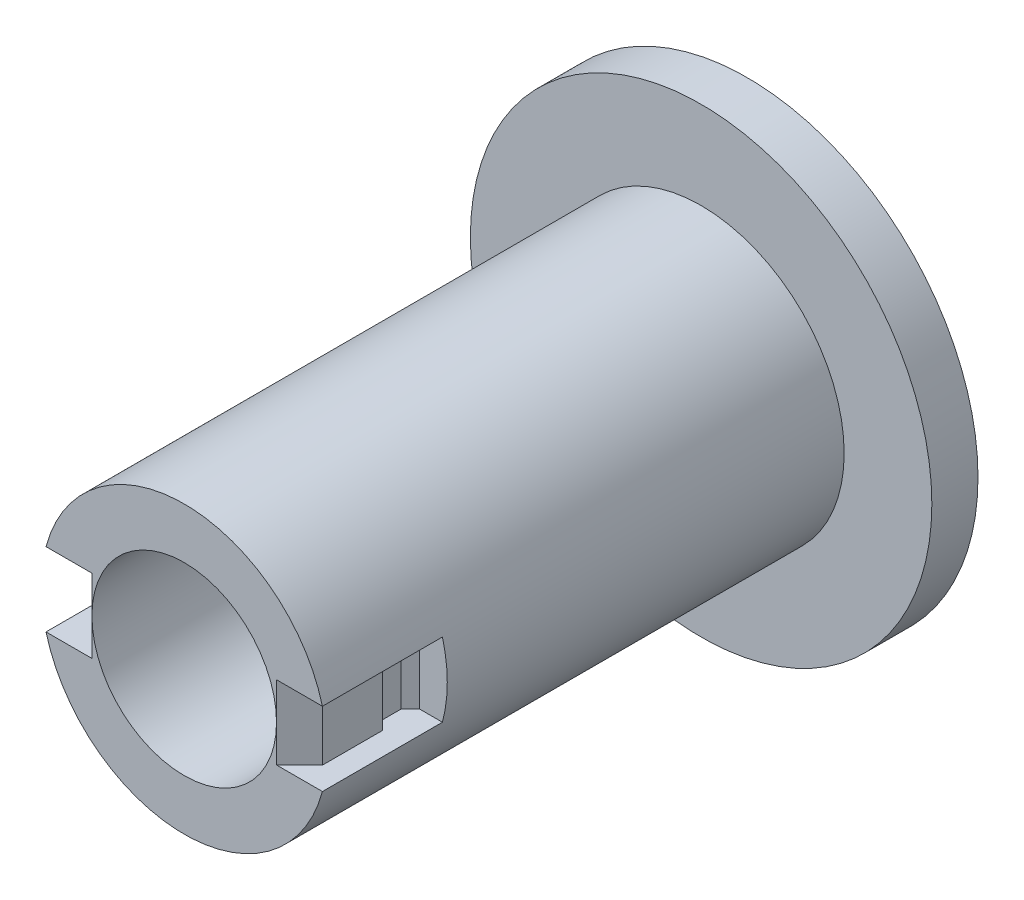
ISO-10303-21;
HEADER;
FILE_DESCRIPTION(('STEP AP214'),'2;1');
FILE_NAME('part.step','',(''),(''),'','','');
FILE_SCHEMA(('AUTOMOTIVE_DESIGN { 1 0 10303 214 1 1 1 1 }'));
ENDSEC;
DATA;
#1=APPLICATION_CONTEXT('core data for automotive mechanical design processes');
#2=APPLICATION_PROTOCOL_DEFINITION('international standard','automotive_design',2000,#1);
#3=PRODUCT_CONTEXT('',#1,'mechanical');
#4=PRODUCT('Part','Part','',(#3));
#5=PRODUCT_RELATED_PRODUCT_CATEGORY('part','',(#4));
#6=PRODUCT_DEFINITION_FORMATION('','',#4);
#7=PRODUCT_DEFINITION_CONTEXT('part definition',#1,'design');
#8=PRODUCT_DEFINITION('design','',#6,#7);
#9=PRODUCT_DEFINITION_SHAPE('','',#8);
#10=(LENGTH_UNIT() NAMED_UNIT(*) SI_UNIT(.MILLI.,.METRE.));
#11=(NAMED_UNIT(*) PLANE_ANGLE_UNIT() SI_UNIT($,.RADIAN.));
#12=(NAMED_UNIT(*) SI_UNIT($,.STERADIAN.) SOLID_ANGLE_UNIT());
#13=UNCERTAINTY_MEASURE_WITH_UNIT(LENGTH_MEASURE(1.E-05),#10,'distance_accuracy_value','');
#14=(GEOMETRIC_REPRESENTATION_CONTEXT(3) GLOBAL_UNCERTAINTY_ASSIGNED_CONTEXT((#13)) GLOBAL_UNIT_ASSIGNED_CONTEXT((#10,
#11,#12)) REPRESENTATION_CONTEXT('',''));
#15=CARTESIAN_POINT('',(0.,0.,0.));
#16=DIRECTION('',(0.,0.,1.));
#17=DIRECTION('',(1.,0.,0.));
#18=AXIS2_PLACEMENT_3D('',#15,#16,#17);
#19=CARTESIAN_POINT('',(0.,0.,56.));
#20=DIRECTION('',(0.,0.,1.));
#21=DIRECTION('',(1.,0.,0.));
#22=AXIS2_PLACEMENT_3D('',#19,#20,#21);
#23=PLANE('',#22);
#24=DIRECTION('',(-1.,0.,0.));
#25=VECTOR('',#24,1.);
#26=CARTESIAN_POINT('',(0.,4.,56.));
#27=LINE('',#26,#25);
#28=CARTESIAN_POINT('',(-10.,4.,56.));
#29=VERTEX_POINT('',#28);
#30=CARTESIAN_POINT('',(-14.9749791318719,4.,56.));
#31=VERTEX_POINT('',#30);
#32=EDGE_CURVE('E191',#29,#31,#27,.T.);
#33=ORIENTED_EDGE('',*,*,#32,.F.);
#34=DIRECTION('',(0.,-1.,0.));
#35=VECTOR('',#34,1.);
#36=CARTESIAN_POINT('',(-10.,4.,56.));
#37=LINE('',#36,#35);
#38=CARTESIAN_POINT('',(-10.,0.,56.));
#39=VERTEX_POINT('',#38);
#40=EDGE_CURVE('E169',#29,#39,#37,.T.);
#41=ORIENTED_EDGE('',*,*,#40,.T.);
#42=CARTESIAN_POINT('',(0.,0.,56.));
#43=DIRECTION('',(0.,0.,1.));
#44=DIRECTION('',(1.,0.,0.));
#45=AXIS2_PLACEMENT_3D('',#42,#43,#44);
#46=CIRCLE('',#45,10.);
#47=CARTESIAN_POINT('',(10.,0.,56.));
#48=VERTEX_POINT('',#47);
#49=EDGE_CURVE('E277',#48,#39,#46,.T.);
#50=ORIENTED_EDGE('',*,*,#49,.F.);
#51=DIRECTION('',(0.,-1.,0.));
#52=VECTOR('',#51,1.);
#53=CARTESIAN_POINT('',(10.,4.,56.));
#54=LINE('',#53,#52);
#55=CARTESIAN_POINT('',(10.,4.,56.));
#56=VERTEX_POINT('',#55);
#57=EDGE_CURVE('E256',#56,#48,#54,.T.);
#58=ORIENTED_EDGE('',*,*,#57,.F.);
#59=DIRECTION('',(1.,0.,0.));
#60=VECTOR('',#59,1.);
#61=CARTESIAN_POINT('',(0.,4.,56.));
#62=LINE('',#61,#60);
#63=CARTESIAN_POINT('',(14.9749791318719,4.,56.));
#64=VERTEX_POINT('',#63);
#65=EDGE_CURVE('E247',#56,#64,#62,.T.);
#66=ORIENTED_EDGE('',*,*,#65,.T.);
#67=CARTESIAN_POINT('',(0.,0.,56.));
#68=DIRECTION('',(0.,0.,1.));
#69=DIRECTION('',(1.,0.,0.));
#70=AXIS2_PLACEMENT_3D('',#67,#68,#69);
#71=CIRCLE('',#70,15.5);
#72=EDGE_CURVE('E289',#64,#31,#71,.T.);
#73=ORIENTED_EDGE('',*,*,#72,.T.);
#74=EDGE_LOOP('',(#33,#41,#50,#58,#66,#73));
#75=FACE_BOUND('',#74,.T.);
#76=ADVANCED_FACE('F33',(#75),#23,.T.);
#77=CARTESIAN_POINT('',(0.,0.,56.));
#78=DIRECTION('',(0.,0.,-1.));
#79=DIRECTION('',(-1.,0.,0.));
#80=AXIS2_PLACEMENT_3D('',#77,#78,#79);
#81=CYLINDRICAL_SURFACE('',#80,15.5);
#82=CARTESIAN_POINT('',(0.,0.,43.));
#83=DIRECTION('',(0.,0.,-1.));
#84=DIRECTION('',(-1.,0.,0.));
#85=AXIS2_PLACEMENT_3D('',#82,#83,#84);
#86=CIRCLE('',#85,15.5);
#87=CARTESIAN_POINT('',(-14.9749791318719,-4.,43.));
#88=VERTEX_POINT('',#87);
#89=CARTESIAN_POINT('',(-14.9749791318719,4.,43.));
#90=VERTEX_POINT('',#89);
#91=EDGE_CURVE('E11',#88,#90,#86,.T.);
#92=ORIENTED_EDGE('',*,*,#91,.T.);
#93=DIRECTION('',(0.,0.,-1.));
#94=VECTOR('',#93,1.);
#95=CARTESIAN_POINT('',(-14.9749791318719,4.,56.));
#96=LINE('',#95,#94);
#97=EDGE_CURVE('E217',#90,#31,#96,.F.);
#98=ORIENTED_EDGE('',*,*,#97,.T.);
#99=ORIENTED_EDGE('',*,*,#72,.F.);
#100=DIRECTION('',(0.,0.,-1.));
#101=VECTOR('',#100,1.);
#102=CARTESIAN_POINT('',(14.9749791318719,4.,56.));
#103=LINE('',#102,#101);
#104=CARTESIAN_POINT('',(14.9749791318719,4.,43.));
#105=VERTEX_POINT('',#104);
#106=EDGE_CURVE('E269',#64,#105,#103,.T.);
#107=ORIENTED_EDGE('',*,*,#106,.T.);
#108=CARTESIAN_POINT('',(0.,0.,43.));
#109=DIRECTION('',(0.,0.,1.));
#110=DIRECTION('',(1.,0.,0.));
#111=AXIS2_PLACEMENT_3D('',#108,#109,#110);
#112=CIRCLE('',#111,15.5);
#113=CARTESIAN_POINT('',(14.9749791318719,-4.,43.));
#114=VERTEX_POINT('',#113);
#115=EDGE_CURVE('E41',#114,#105,#112,.T.);
#116=ORIENTED_EDGE('',*,*,#115,.F.);
#117=DIRECTION('',(0.,0.,-1.));
#118=VECTOR('',#117,1.);
#119=CARTESIAN_POINT('',(14.9749791318719,-4.,56.));
#120=LINE('',#119,#118);
#121=CARTESIAN_POINT('',(14.9749791318719,-4.,56.));
#122=VERTEX_POINT('',#121);
#123=EDGE_CURVE('E267',#122,#114,#120,.T.);
#124=ORIENTED_EDGE('',*,*,#123,.F.);
#125=CARTESIAN_POINT('',(-14.9749791318719,-4.,56.));
#126=VERTEX_POINT('',#125);
#127=EDGE_CURVE('E288',#126,#122,#71,.T.);
#128=ORIENTED_EDGE('',*,*,#127,.F.);
#129=DIRECTION('',(0.,0.,-1.));
#130=VECTOR('',#129,1.);
#131=CARTESIAN_POINT('',(-14.9749791318719,-4.,56.));
#132=LINE('',#131,#130);
#133=EDGE_CURVE('E48',#88,#126,#132,.F.);
#134=ORIENTED_EDGE('',*,*,#133,.F.);
#135=EDGE_LOOP('',(#92,#98,#99,#107,#116,#124,#128,#134));
#136=FACE_BOUND('',#135,.T.);
#137=CARTESIAN_POINT('',(0.,0.,0.));
#138=DIRECTION('',(0.,0.,-1.));
#139=DIRECTION('',(-1.,0.,0.));
#140=AXIS2_PLACEMENT_3D('',#137,#138,#139);
#141=CIRCLE('',#140,15.5);
#142=CARTESIAN_POINT('',(-15.5,0.,0.));
#143=VERTEX_POINT('',#142);
#144=EDGE_CURVE('E283',#143,#143,#141,.T.);
#145=ORIENTED_EDGE('',*,*,#144,.F.);
#146=EDGE_LOOP('',(#145));
#147=FACE_BOUND('',#146,.T.);
#148=ADVANCED_FACE('F35',(#136,#147),#81,.T.);
#149=CARTESIAN_POINT('',(-10.,-4.,56.));
#150=VERTEX_POINT('',#149);
#151=EDGE_CURVE('E213',#39,#150,#37,.T.);
#152=ORIENTED_EDGE('',*,*,#151,.T.);
#153=DIRECTION('',(-1.,0.,0.));
#154=VECTOR('',#153,1.);
#155=CARTESIAN_POINT('',(0.,-4.,56.));
#156=LINE('',#155,#154);
#157=EDGE_CURVE('E161',#150,#126,#156,.T.);
#158=ORIENTED_EDGE('',*,*,#157,.T.);
#159=ORIENTED_EDGE('',*,*,#127,.T.);
#160=DIRECTION('',(1.,0.,0.));
#161=VECTOR('',#160,1.);
#162=CARTESIAN_POINT('',(0.,-4.,56.));
#163=LINE('',#162,#161);
#164=CARTESIAN_POINT('',(10.,-4.,56.));
#165=VERTEX_POINT('',#164);
#166=EDGE_CURVE('E232',#165,#122,#163,.T.);
#167=ORIENTED_EDGE('',*,*,#166,.F.);
#168=EDGE_CURVE('E255',#48,#165,#54,.T.);
#169=ORIENTED_EDGE('',*,*,#168,.F.);
#170=EDGE_CURVE('E272',#39,#48,#46,.T.);
#171=ORIENTED_EDGE('',*,*,#170,.F.);
#172=EDGE_LOOP('',(#152,#158,#159,#167,#169,#171));
#173=FACE_BOUND('',#172,.T.);
#174=ADVANCED_FACE('F337',(#173),#23,.T.);
#175=CARTESIAN_POINT('',(0.,0.,0.));
#176=DIRECTION('',(0.,0.,-1.));
#177=DIRECTION('',(-1.,0.,0.));
#178=AXIS2_PLACEMENT_3D('',#175,#176,#177);
#179=PLANE('',#178);
#180=CARTESIAN_POINT('',(0.,0.,0.));
#181=DIRECTION('',(0.,0.,-1.));
#182=DIRECTION('',(-1.,0.,0.));
#183=AXIS2_PLACEMENT_3D('',#180,#181,#182);
#184=CIRCLE('',#183,25.);
#185=CARTESIAN_POINT('',(-25.,0.,0.));
#186=VERTEX_POINT('',#185);
#187=EDGE_CURVE('E276',#186,#186,#184,.T.);
#188=ORIENTED_EDGE('',*,*,#187,.F.);
#189=EDGE_LOOP('',(#188));
#190=FACE_BOUND('',#189,.T.);
#191=ORIENTED_EDGE('',*,*,#144,.T.);
#192=EDGE_LOOP('',(#191));
#193=FACE_BOUND('',#192,.T.);
#194=ADVANCED_FACE('F370',(#190,#193),#179,.F.);
#195=CARTESIAN_POINT('',(0.,0.,-5.));
#196=DIRECTION('',(0.,0.,1.));
#197=DIRECTION('',(1.,0.,0.));
#198=AXIS2_PLACEMENT_3D('',#195,#196,#197);
#199=CYLINDRICAL_SURFACE('',#198,25.);
#200=CARTESIAN_POINT('',(0.,0.,-5.));
#201=DIRECTION('',(0.,0.,-1.));
#202=DIRECTION('',(-1.,0.,0.));
#203=AXIS2_PLACEMENT_3D('',#200,#201,#202);
#204=CIRCLE('',#203,25.);
#205=CARTESIAN_POINT('',(-25.,0.,-5.));
#206=VERTEX_POINT('',#205);
#207=EDGE_CURVE('E280',#206,#206,#204,.T.);
#208=ORIENTED_EDGE('',*,*,#207,.F.);
#209=EDGE_LOOP('',(#208));
#210=FACE_BOUND('',#209,.T.);
#211=ORIENTED_EDGE('',*,*,#187,.T.);
#212=EDGE_LOOP('',(#211));
#213=FACE_BOUND('',#212,.T.);
#214=ADVANCED_FACE('F374',(#210,#213),#199,.T.);
#215=CARTESIAN_POINT('',(0.,0.,-5.));
#216=DIRECTION('',(0.,0.,-1.));
#217=DIRECTION('',(-1.,0.,0.));
#218=AXIS2_PLACEMENT_3D('',#215,#216,#217);
#219=PLANE('',#218);
#220=CARTESIAN_POINT('',(0.,0.,-5.));
#221=DIRECTION('',(0.,0.,1.));
#222=DIRECTION('',(1.,0.,0.));
#223=AXIS2_PLACEMENT_3D('',#220,#221,#222);
#224=CIRCLE('',#223,10.);
#225=CARTESIAN_POINT('',(10.,0.,-5.));
#226=VERTEX_POINT('',#225);
#227=EDGE_CURVE('E273',#226,#226,#224,.T.);
#228=ORIENTED_EDGE('',*,*,#227,.T.);
#229=EDGE_LOOP('',(#228));
#230=FACE_BOUND('',#229,.T.);
#231=ORIENTED_EDGE('',*,*,#207,.T.);
#232=EDGE_LOOP('',(#231));
#233=FACE_BOUND('',#232,.T.);
#234=ADVANCED_FACE('F380',(#230,#233),#219,.T.);
#235=CARTESIAN_POINT('',(0.,0.,-5.));
#236=DIRECTION('',(0.,0.,1.));
#237=DIRECTION('',(1.,0.,0.));
#238=AXIS2_PLACEMENT_3D('',#235,#236,#237);
#239=CYLINDRICAL_SURFACE('',#238,10.);
#240=ORIENTED_EDGE('',*,*,#227,.F.);
#241=EDGE_LOOP('',(#240));
#242=FACE_BOUND('',#241,.T.);
#243=ORIENTED_EDGE('',*,*,#49,.T.);
#244=ORIENTED_EDGE('',*,*,#170,.T.);
#245=EDGE_LOOP('',(#243,#244));
#246=FACE_BOUND('',#245,.T.);
#247=ADVANCED_FACE('F387',(#242,#246),#239,.F.);
#248=CARTESIAN_POINT('',(0.,4.,43.));
#249=DIRECTION('',(0.,0.,1.));
#250=DIRECTION('',(1.,0.,0.));
#251=AXIS2_PLACEMENT_3D('',#248,#249,#250);
#252=PLANE('',#251);
#253=ORIENTED_EDGE('',*,*,#115,.T.);
#254=DIRECTION('',(-1.,0.,0.));
#255=VECTOR('',#254,1.);
#256=CARTESIAN_POINT('',(0.,4.,43.));
#257=LINE('',#256,#255);
#258=CARTESIAN_POINT('',(12.5,4.,43.));
#259=VERTEX_POINT('',#258);
#260=EDGE_CURVE('E250',#105,#259,#257,.T.);
#261=ORIENTED_EDGE('',*,*,#260,.T.);
#262=DIRECTION('',(0.,-1.,0.));
#263=VECTOR('',#262,1.);
#264=CARTESIAN_POINT('',(12.5,4.,43.));
#265=LINE('',#264,#263);
#266=CARTESIAN_POINT('',(12.5,-4.,43.));
#267=VERTEX_POINT('',#266);
#268=EDGE_CURVE('E252',#259,#267,#265,.T.);
#269=ORIENTED_EDGE('',*,*,#268,.T.);
#270=DIRECTION('',(-1.,0.,0.));
#271=VECTOR('',#270,1.);
#272=CARTESIAN_POINT('',(0.,-4.,43.));
#273=LINE('',#272,#271);
#274=EDGE_CURVE('E234',#114,#267,#273,.T.);
#275=ORIENTED_EDGE('',*,*,#274,.F.);
#276=EDGE_LOOP('',(#253,#261,#269,#275));
#277=FACE_BOUND('',#276,.T.);
#278=ADVANCED_FACE('F295',(#277),#252,.T.);
#279=CARTESIAN_POINT('',(0.,4.,0.));
#280=DIRECTION('',(0.,1.,0.));
#281=DIRECTION('',(0.,0.,1.));
#282=AXIS2_PLACEMENT_3D('',#279,#280,#281);
#283=PLANE('',#282);
#284=ORIENTED_EDGE('',*,*,#65,.F.);
#285=DIRECTION('',(-0.707106781186545,0.,0.70710678118655));
#286=VECTOR('',#285,1.);
#287=CARTESIAN_POINT('',(33.,4.,32.9999999999998));
#288=LINE('',#287,#286);
#289=CARTESIAN_POINT('',(12.5,4.,53.5));
#290=VERTEX_POINT('',#289);
#291=EDGE_CURVE('E245',#290,#56,#288,.T.);
#292=ORIENTED_EDGE('',*,*,#291,.F.);
#293=DIRECTION('',(0.,0.,1.));
#294=VECTOR('',#293,1.);
#295=CARTESIAN_POINT('',(12.5,4.,0.));
#296=LINE('',#295,#294);
#297=CARTESIAN_POINT('',(12.5,4.,47.));
#298=VERTEX_POINT('',#297);
#299=EDGE_CURVE('E243',#298,#290,#296,.T.);
#300=ORIENTED_EDGE('',*,*,#299,.F.);
#301=DIRECTION('',(0.707106781186551,0.,0.707106781186544));
#302=VECTOR('',#301,1.);
#303=CARTESIAN_POINT('',(-17.25,4.,17.2500000000002));
#304=LINE('',#303,#302);
#305=CARTESIAN_POINT('',(11.5,4.,46.));
#306=VERTEX_POINT('',#305);
#307=EDGE_CURVE('E241',#306,#298,#304,.T.);
#308=ORIENTED_EDGE('',*,*,#307,.F.);
#309=DIRECTION('',(0.,0.,1.));
#310=VECTOR('',#309,1.);
#311=CARTESIAN_POINT('',(11.5,4.,0.));
#312=LINE('',#311,#310);
#313=CARTESIAN_POINT('',(11.5,4.,44.));
#314=VERTEX_POINT('',#313);
#315=EDGE_CURVE('E239',#314,#306,#312,.T.);
#316=ORIENTED_EDGE('',*,*,#315,.F.);
#317=DIRECTION('',(-0.707106781186541,0.,0.707106781186554));
#318=VECTOR('',#317,1.);
#319=CARTESIAN_POINT('',(27.7500000000001,4.,27.7499999999996));
#320=LINE('',#319,#318);
#321=EDGE_CURVE('E236',#259,#314,#320,.T.);
#322=ORIENTED_EDGE('',*,*,#321,.F.);
#323=ORIENTED_EDGE('',*,*,#260,.F.);
#324=ORIENTED_EDGE('',*,*,#106,.F.);
#325=EDGE_LOOP('',(#284,#292,#300,#308,#316,#322,#323,#324));
#326=FACE_BOUND('',#325,.T.);
#327=ADVANCED_FACE('F302',(#326),#283,.F.);
#328=CARTESIAN_POINT('',(0.,-4.,0.));
#329=DIRECTION('',(0.,1.,0.));
#330=DIRECTION('',(0.,0.,1.));
#331=AXIS2_PLACEMENT_3D('',#328,#329,#330);
#332=PLANE('',#331);
#333=ORIENTED_EDGE('',*,*,#123,.T.);
#334=ORIENTED_EDGE('',*,*,#274,.T.);
#335=DIRECTION('',(-0.707106781186541,0.,0.707106781186554));
#336=VECTOR('',#335,1.);
#337=CARTESIAN_POINT('',(27.7500000000001,-4.,27.7499999999996));
#338=LINE('',#337,#336);
#339=CARTESIAN_POINT('',(11.5,-4.,44.));
#340=VERTEX_POINT('',#339);
#341=EDGE_CURVE('E220',#267,#340,#338,.T.);
#342=ORIENTED_EDGE('',*,*,#341,.T.);
#343=DIRECTION('',(0.,0.,1.));
#344=VECTOR('',#343,1.);
#345=CARTESIAN_POINT('',(11.5,-4.,0.));
#346=LINE('',#345,#344);
#347=CARTESIAN_POINT('',(11.5,-4.,46.));
#348=VERTEX_POINT('',#347);
#349=EDGE_CURVE('E223',#340,#348,#346,.T.);
#350=ORIENTED_EDGE('',*,*,#349,.T.);
#351=DIRECTION('',(0.707106781186551,0.,0.707106781186544));
#352=VECTOR('',#351,1.);
#353=CARTESIAN_POINT('',(-17.25,-4.,17.2500000000002));
#354=LINE('',#353,#352);
#355=CARTESIAN_POINT('',(12.5,-4.,47.));
#356=VERTEX_POINT('',#355);
#357=EDGE_CURVE('E226',#348,#356,#354,.T.);
#358=ORIENTED_EDGE('',*,*,#357,.T.);
#359=DIRECTION('',(0.,0.,1.));
#360=VECTOR('',#359,1.);
#361=CARTESIAN_POINT('',(12.5,-4.,0.));
#362=LINE('',#361,#360);
#363=CARTESIAN_POINT('',(12.5,-4.,53.5));
#364=VERTEX_POINT('',#363);
#365=EDGE_CURVE('E229',#356,#364,#362,.T.);
#366=ORIENTED_EDGE('',*,*,#365,.T.);
#367=DIRECTION('',(-0.707106781186545,0.,0.70710678118655));
#368=VECTOR('',#367,1.);
#369=CARTESIAN_POINT('',(33.,-4.,32.9999999999998));
#370=LINE('',#369,#368);
#371=EDGE_CURVE('E56',#364,#165,#370,.T.);
#372=ORIENTED_EDGE('',*,*,#371,.T.);
#373=ORIENTED_EDGE('',*,*,#166,.T.);
#374=EDGE_LOOP('',(#333,#334,#342,#350,#358,#366,#372,#373));
#375=FACE_BOUND('',#374,.T.);
#376=ADVANCED_FACE('F332',(#375),#332,.T.);
#377=CARTESIAN_POINT('',(27.7500000000001,4.,27.7499999999996));
#378=DIRECTION('',(0.707106781186554,0.,0.707106781186541));
#379=DIRECTION('',(0.707106781186541,0.,-0.707106781186554));
#380=AXIS2_PLACEMENT_3D('',#377,#378,#379);
#381=PLANE('',#380);
#382=ORIENTED_EDGE('',*,*,#268,.F.);
#383=ORIENTED_EDGE('',*,*,#321,.T.);
#384=DIRECTION('',(0.,-1.,0.));
#385=VECTOR('',#384,1.);
#386=CARTESIAN_POINT('',(11.5,4.,44.));
#387=LINE('',#386,#385);
#388=EDGE_CURVE('E265',#314,#340,#387,.T.);
#389=ORIENTED_EDGE('',*,*,#388,.T.);
#390=ORIENTED_EDGE('',*,*,#341,.F.);
#391=EDGE_LOOP('',(#382,#383,#389,#390));
#392=FACE_BOUND('',#391,.T.);
#393=ADVANCED_FACE('F328',(#392),#381,.T.);
#394=CARTESIAN_POINT('',(11.5,4.,0.));
#395=DIRECTION('',(1.,0.,0.));
#396=DIRECTION('',(0.,0.,-1.));
#397=AXIS2_PLACEMENT_3D('',#394,#395,#396);
#398=PLANE('',#397);
#399=ORIENTED_EDGE('',*,*,#388,.F.);
#400=ORIENTED_EDGE('',*,*,#315,.T.);
#401=DIRECTION('',(0.,-1.,0.));
#402=VECTOR('',#401,1.);
#403=CARTESIAN_POINT('',(11.5,4.,46.));
#404=LINE('',#403,#402);
#405=EDGE_CURVE('E263',#306,#348,#404,.T.);
#406=ORIENTED_EDGE('',*,*,#405,.T.);
#407=ORIENTED_EDGE('',*,*,#349,.F.);
#408=EDGE_LOOP('',(#399,#400,#406,#407));
#409=FACE_BOUND('',#408,.T.);
#410=ADVANCED_FACE('F331',(#409),#398,.T.);
#411=CARTESIAN_POINT('',(-17.25,4.,17.2500000000002));
#412=DIRECTION('',(0.707106781186544,0.,-0.707106781186551));
#413=DIRECTION('',(-0.707106781186551,0.,-0.707106781186544));
#414=AXIS2_PLACEMENT_3D('',#411,#412,#413);
#415=PLANE('',#414);
#416=ORIENTED_EDGE('',*,*,#405,.F.);
#417=ORIENTED_EDGE('',*,*,#307,.T.);
#418=DIRECTION('',(0.,-1.,0.));
#419=VECTOR('',#418,1.);
#420=CARTESIAN_POINT('',(12.5,4.,47.));
#421=LINE('',#420,#419);
#422=EDGE_CURVE('E261',#298,#356,#421,.T.);
#423=ORIENTED_EDGE('',*,*,#422,.T.);
#424=ORIENTED_EDGE('',*,*,#357,.F.);
#425=EDGE_LOOP('',(#416,#417,#423,#424));
#426=FACE_BOUND('',#425,.T.);
#427=ADVANCED_FACE('F324',(#426),#415,.T.);
#428=CARTESIAN_POINT('',(12.5,4.,0.));
#429=DIRECTION('',(1.,0.,0.));
#430=DIRECTION('',(0.,0.,-1.));
#431=AXIS2_PLACEMENT_3D('',#428,#429,#430);
#432=PLANE('',#431);
#433=ORIENTED_EDGE('',*,*,#422,.F.);
#434=ORIENTED_EDGE('',*,*,#299,.T.);
#435=DIRECTION('',(0.,-1.,0.));
#436=VECTOR('',#435,1.);
#437=CARTESIAN_POINT('',(12.5,4.,53.5));
#438=LINE('',#437,#436);
#439=EDGE_CURVE('E259',#290,#364,#438,.T.);
#440=ORIENTED_EDGE('',*,*,#439,.T.);
#441=ORIENTED_EDGE('',*,*,#365,.F.);
#442=EDGE_LOOP('',(#433,#434,#440,#441));
#443=FACE_BOUND('',#442,.T.);
#444=ADVANCED_FACE('F320',(#443),#432,.T.);
#445=CARTESIAN_POINT('',(33.,4.,32.9999999999998));
#446=DIRECTION('',(0.70710678118655,0.,0.707106781186545));
#447=DIRECTION('',(0.707106781186545,0.,-0.70710678118655));
#448=AXIS2_PLACEMENT_3D('',#445,#446,#447);
#449=PLANE('',#448);
#450=ORIENTED_EDGE('',*,*,#439,.F.);
#451=ORIENTED_EDGE('',*,*,#291,.T.);
#452=ORIENTED_EDGE('',*,*,#57,.T.);
#453=ORIENTED_EDGE('',*,*,#168,.T.);
#454=ORIENTED_EDGE('',*,*,#371,.F.);
#455=EDGE_LOOP('',(#450,#451,#452,#453,#454));
#456=FACE_BOUND('',#455,.T.);
#457=ADVANCED_FACE('F315',(#456),#449,.T.);
#458=CARTESIAN_POINT('',(0.,4.,43.));
#459=DIRECTION('',(0.,0.,-1.));
#460=DIRECTION('',(-1.,0.,0.));
#461=AXIS2_PLACEMENT_3D('',#458,#459,#460);
#462=PLANE('',#461);
#463=ORIENTED_EDGE('',*,*,#91,.F.);
#464=DIRECTION('',(1.,0.,0.));
#465=VECTOR('',#464,1.);
#466=CARTESIAN_POINT('',(0.,-4.,43.));
#467=LINE('',#466,#465);
#468=CARTESIAN_POINT('',(-12.5,-4.,43.));
#469=VERTEX_POINT('',#468);
#470=EDGE_CURVE('E154',#88,#469,#467,.T.);
#471=ORIENTED_EDGE('',*,*,#470,.T.);
#472=DIRECTION('',(0.,-1.,0.));
#473=VECTOR('',#472,1.);
#474=CARTESIAN_POINT('',(-12.5,4.,43.));
#475=LINE('',#474,#473);
#476=CARTESIAN_POINT('',(-12.5,4.,43.));
#477=VERTEX_POINT('',#476);
#478=EDGE_CURVE('E158',#477,#469,#475,.T.);
#479=ORIENTED_EDGE('',*,*,#478,.F.);
#480=DIRECTION('',(1.,0.,0.));
#481=VECTOR('',#480,1.);
#482=CARTESIAN_POINT('',(0.,4.,43.));
#483=LINE('',#482,#481);
#484=EDGE_CURVE('E189',#90,#477,#483,.T.);
#485=ORIENTED_EDGE('',*,*,#484,.F.);
#486=EDGE_LOOP('',(#463,#471,#479,#485));
#487=FACE_BOUND('',#486,.T.);
#488=ADVANCED_FACE('F156',(#487),#462,.F.);
#489=CARTESIAN_POINT('',(0.,4.,0.));
#490=DIRECTION('',(0.,1.,0.));
#491=DIRECTION('',(0.,0.,1.));
#492=AXIS2_PLACEMENT_3D('',#489,#490,#491);
#493=PLANE('',#492);
#494=ORIENTED_EDGE('',*,*,#484,.T.);
#495=DIRECTION('',(0.707106781186541,0.,0.707106781186554));
#496=VECTOR('',#495,1.);
#497=CARTESIAN_POINT('',(-27.7500000000001,4.,27.7499999999996));
#498=LINE('',#497,#496);
#499=CARTESIAN_POINT('',(-11.5,4.,44.));
#500=VERTEX_POINT('',#499);
#501=EDGE_CURVE('E168',#477,#500,#498,.T.);
#502=ORIENTED_EDGE('',*,*,#501,.T.);
#503=DIRECTION('',(0.,0.,1.));
#504=VECTOR('',#503,1.);
#505=CARTESIAN_POINT('',(-11.5,4.,0.));
#506=LINE('',#505,#504);
#507=CARTESIAN_POINT('',(-11.5,4.,46.));
#508=VERTEX_POINT('',#507);
#509=EDGE_CURVE('E202',#500,#508,#506,.T.);
#510=ORIENTED_EDGE('',*,*,#509,.T.);
#511=DIRECTION('',(-0.707106781186551,0.,0.707106781186544));
#512=VECTOR('',#511,1.);
#513=CARTESIAN_POINT('',(17.25,4.,17.2500000000002));
#514=LINE('',#513,#512);
#515=CARTESIAN_POINT('',(-12.5,4.,47.));
#516=VERTEX_POINT('',#515);
#517=EDGE_CURVE('E199',#508,#516,#514,.T.);
#518=ORIENTED_EDGE('',*,*,#517,.T.);
#519=DIRECTION('',(0.,0.,1.));
#520=VECTOR('',#519,1.);
#521=CARTESIAN_POINT('',(-12.5,4.,0.));
#522=LINE('',#521,#520);
#523=CARTESIAN_POINT('',(-12.5,4.,53.5));
#524=VERTEX_POINT('',#523);
#525=EDGE_CURVE('E196',#516,#524,#522,.T.);
#526=ORIENTED_EDGE('',*,*,#525,.T.);
#527=DIRECTION('',(0.707106781186545,0.,0.70710678118655));
#528=VECTOR('',#527,1.);
#529=CARTESIAN_POINT('',(-33.,4.,32.9999999999998));
#530=LINE('',#529,#528);
#531=EDGE_CURVE('E193',#524,#29,#530,.T.);
#532=ORIENTED_EDGE('',*,*,#531,.T.);
#533=ORIENTED_EDGE('',*,*,#32,.T.);
#534=ORIENTED_EDGE('',*,*,#97,.F.);
#535=EDGE_LOOP('',(#494,#502,#510,#518,#526,#532,#533,#534));
#536=FACE_BOUND('',#535,.T.);
#537=ADVANCED_FACE('F354',(#536),#493,.F.);
#538=CARTESIAN_POINT('',(0.,-4.,0.));
#539=DIRECTION('',(0.,1.,0.));
#540=DIRECTION('',(0.,0.,1.));
#541=AXIS2_PLACEMENT_3D('',#538,#539,#540);
#542=PLANE('',#541);
#543=ORIENTED_EDGE('',*,*,#133,.T.);
#544=ORIENTED_EDGE('',*,*,#157,.F.);
#545=DIRECTION('',(0.707106781186545,0.,0.70710678118655));
#546=VECTOR('',#545,1.);
#547=CARTESIAN_POINT('',(-33.,-4.,32.9999999999998));
#548=LINE('',#547,#546);
#549=CARTESIAN_POINT('',(-12.5,-4.,53.5));
#550=VERTEX_POINT('',#549);
#551=EDGE_CURVE('E179',#550,#150,#548,.T.);
#552=ORIENTED_EDGE('',*,*,#551,.F.);
#553=DIRECTION('',(0.,0.,1.));
#554=VECTOR('',#553,1.);
#555=CARTESIAN_POINT('',(-12.5,-4.,0.));
#556=LINE('',#555,#554);
#557=CARTESIAN_POINT('',(-12.5,-4.,47.));
#558=VERTEX_POINT('',#557);
#559=EDGE_CURVE('E181',#558,#550,#556,.T.);
#560=ORIENTED_EDGE('',*,*,#559,.F.);
#561=DIRECTION('',(-0.707106781186551,0.,0.707106781186544));
#562=VECTOR('',#561,1.);
#563=CARTESIAN_POINT('',(17.25,-4.,17.2500000000002));
#564=LINE('',#563,#562);
#565=CARTESIAN_POINT('',(-11.5,-4.,46.));
#566=VERTEX_POINT('',#565);
#567=EDGE_CURVE('E184',#566,#558,#564,.T.);
#568=ORIENTED_EDGE('',*,*,#567,.F.);
#569=DIRECTION('',(0.,0.,1.));
#570=VECTOR('',#569,1.);
#571=CARTESIAN_POINT('',(-11.5,-4.,0.));
#572=LINE('',#571,#570);
#573=CARTESIAN_POINT('',(-11.5,-4.,44.));
#574=VERTEX_POINT('',#573);
#575=EDGE_CURVE('E175',#574,#566,#572,.T.);
#576=ORIENTED_EDGE('',*,*,#575,.F.);
#577=DIRECTION('',(0.707106781186541,0.,0.707106781186554));
#578=VECTOR('',#577,1.);
#579=CARTESIAN_POINT('',(-27.7500000000001,-4.,27.7499999999996));
#580=LINE('',#579,#578);
#581=EDGE_CURVE('E162',#469,#574,#580,.T.);
#582=ORIENTED_EDGE('',*,*,#581,.F.);
#583=ORIENTED_EDGE('',*,*,#470,.F.);
#584=EDGE_LOOP('',(#543,#544,#552,#560,#568,#576,#582,#583));
#585=FACE_BOUND('',#584,.T.);
#586=ADVANCED_FACE('F172',(#585),#542,.T.);
#587=CARTESIAN_POINT('',(-27.7500000000001,4.,27.7499999999996));
#588=DIRECTION('',(0.707106781186554,0.,-0.707106781186541));
#589=DIRECTION('',(-0.707106781186541,0.,-0.707106781186554));
#590=AXIS2_PLACEMENT_3D('',#587,#588,#589);
#591=PLANE('',#590);
#592=DIRECTION('',(0.,-1.,0.));
#593=VECTOR('',#592,1.);
#594=CARTESIAN_POINT('',(-11.5,4.,44.));
#595=LINE('',#594,#593);
#596=EDGE_CURVE('E205',#500,#574,#595,.T.);
#597=ORIENTED_EDGE('',*,*,#596,.F.);
#598=ORIENTED_EDGE('',*,*,#501,.F.);
#599=ORIENTED_EDGE('',*,*,#478,.T.);
#600=ORIENTED_EDGE('',*,*,#581,.T.);
#601=EDGE_LOOP('',(#597,#598,#599,#600));
#602=FACE_BOUND('',#601,.T.);
#603=ADVANCED_FACE('F166',(#602),#591,.F.);
#604=CARTESIAN_POINT('',(-33.,4.,32.9999999999998));
#605=DIRECTION('',(0.70710678118655,0.,-0.707106781186545));
#606=DIRECTION('',(-0.707106781186545,0.,-0.70710678118655));
#607=AXIS2_PLACEMENT_3D('',#604,#605,#606);
#608=PLANE('',#607);
#609=ORIENTED_EDGE('',*,*,#40,.F.);
#610=ORIENTED_EDGE('',*,*,#531,.F.);
#611=DIRECTION('',(0.,-1.,0.));
#612=VECTOR('',#611,1.);
#613=CARTESIAN_POINT('',(-12.5,4.,53.5));
#614=LINE('',#613,#612);
#615=EDGE_CURVE('E211',#524,#550,#614,.T.);
#616=ORIENTED_EDGE('',*,*,#615,.T.);
#617=ORIENTED_EDGE('',*,*,#551,.T.);
#618=ORIENTED_EDGE('',*,*,#151,.F.);
#619=EDGE_LOOP('',(#609,#610,#616,#617,#618));
#620=FACE_BOUND('',#619,.T.);
#621=ADVANCED_FACE('F342',(#620),#608,.F.);
#622=CARTESIAN_POINT('',(-12.5,4.,0.));
#623=DIRECTION('',(1.,0.,0.));
#624=DIRECTION('',(0.,0.,-1.));
#625=AXIS2_PLACEMENT_3D('',#622,#623,#624);
#626=PLANE('',#625);
#627=ORIENTED_EDGE('',*,*,#615,.F.);
#628=ORIENTED_EDGE('',*,*,#525,.F.);
#629=DIRECTION('',(0.,-1.,0.));
#630=VECTOR('',#629,1.);
#631=CARTESIAN_POINT('',(-12.5,4.,47.));
#632=LINE('',#631,#630);
#633=EDGE_CURVE('E209',#516,#558,#632,.T.);
#634=ORIENTED_EDGE('',*,*,#633,.T.);
#635=ORIENTED_EDGE('',*,*,#559,.T.);
#636=EDGE_LOOP('',(#627,#628,#634,#635));
#637=FACE_BOUND('',#636,.T.);
#638=ADVANCED_FACE('F346',(#637),#626,.F.);
#639=CARTESIAN_POINT('',(17.25,4.,17.2500000000002));
#640=DIRECTION('',(0.707106781186544,0.,0.707106781186551));
#641=DIRECTION('',(0.707106781186551,0.,-0.707106781186544));
#642=AXIS2_PLACEMENT_3D('',#639,#640,#641);
#643=PLANE('',#642);
#644=ORIENTED_EDGE('',*,*,#633,.F.);
#645=ORIENTED_EDGE('',*,*,#517,.F.);
#646=DIRECTION('',(0.,-1.,0.));
#647=VECTOR('',#646,1.);
#648=CARTESIAN_POINT('',(-11.5,4.,46.));
#649=LINE('',#648,#647);
#650=EDGE_CURVE('E207',#508,#566,#649,.T.);
#651=ORIENTED_EDGE('',*,*,#650,.T.);
#652=ORIENTED_EDGE('',*,*,#567,.T.);
#653=EDGE_LOOP('',(#644,#645,#651,#652));
#654=FACE_BOUND('',#653,.T.);
#655=ADVANCED_FACE('F349',(#654),#643,.F.);
#656=CARTESIAN_POINT('',(-11.5,4.,0.));
#657=DIRECTION('',(1.,0.,0.));
#658=DIRECTION('',(0.,0.,-1.));
#659=AXIS2_PLACEMENT_3D('',#656,#657,#658);
#660=PLANE('',#659);
#661=ORIENTED_EDGE('',*,*,#650,.F.);
#662=ORIENTED_EDGE('',*,*,#509,.F.);
#663=ORIENTED_EDGE('',*,*,#596,.T.);
#664=ORIENTED_EDGE('',*,*,#575,.T.);
#665=EDGE_LOOP('',(#661,#662,#663,#664));
#666=FACE_BOUND('',#665,.T.);
#667=ADVANCED_FACE('F352',(#666),#660,.F.);
#668=CLOSED_SHELL('',(#76,#148,#174,#194,#214,#234,#247,#278,#327,#376,#393,#410,#427,#444,#457,
#488,#537,#586,#603,#621,#638,#655,#667));
#669=MANIFOLD_SOLID_BREP('B2',#668);
#670=ADVANCED_BREP_SHAPE_REPRESENTATION('',(#18,#669),#14);
#671=SHAPE_DEFINITION_REPRESENTATION(#9,#670);
ENDSEC;
END-ISO-10303-21;
